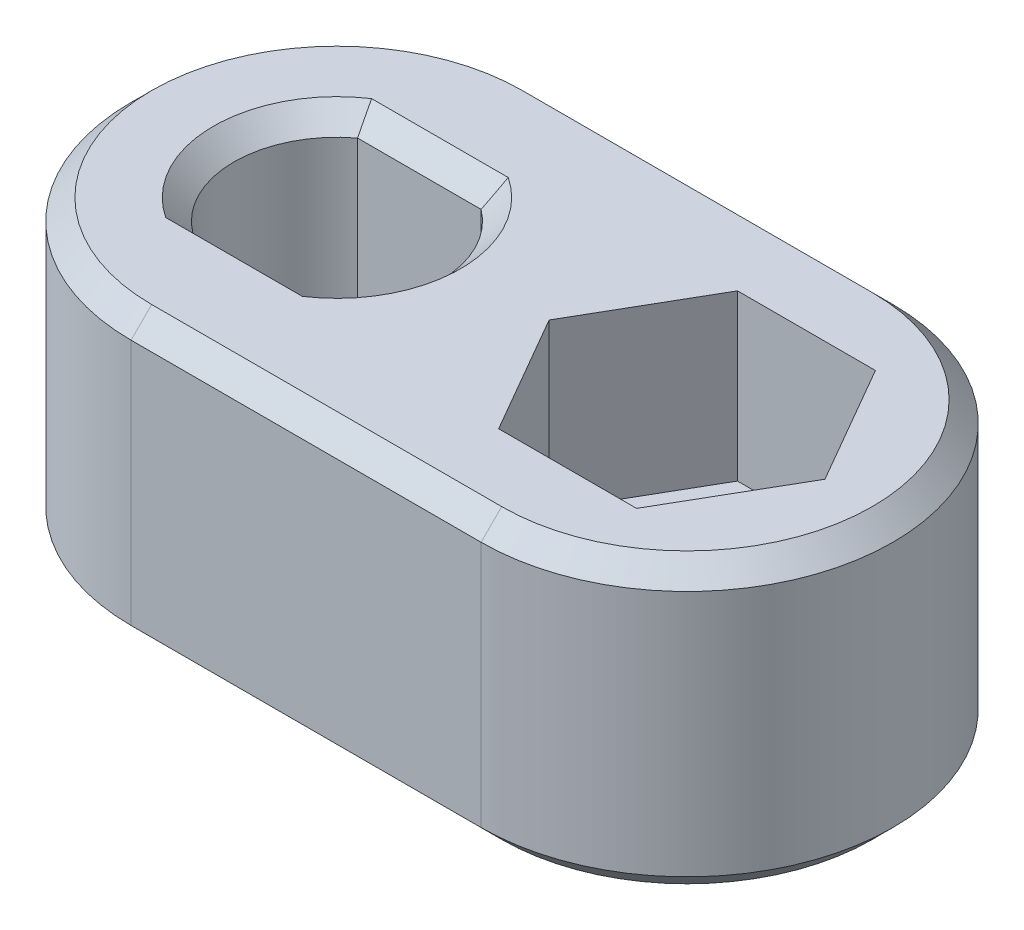
ISO-10303-21;
HEADER;
FILE_DESCRIPTION(('STEP AP214'),'2;1');
FILE_NAME('part.step','',(''),(''),'','','');
FILE_SCHEMA(('AUTOMOTIVE_DESIGN { 1 0 10303 214 1 1 1 1 }'));
ENDSEC;
DATA;
#1=APPLICATION_CONTEXT('core data for automotive mechanical design processes');
#2=APPLICATION_PROTOCOL_DEFINITION('international standard','automotive_design',2000,#1);
#3=PRODUCT_CONTEXT('',#1,'mechanical');
#4=PRODUCT('Part','Part','',(#3));
#5=PRODUCT_RELATED_PRODUCT_CATEGORY('part','',(#4));
#6=PRODUCT_DEFINITION_FORMATION('','',#4);
#7=PRODUCT_DEFINITION_CONTEXT('part definition',#1,'design');
#8=PRODUCT_DEFINITION('design','',#6,#7);
#9=PRODUCT_DEFINITION_SHAPE('','',#8);
#10=(LENGTH_UNIT() NAMED_UNIT(*) SI_UNIT(.MILLI.,.METRE.));
#11=(NAMED_UNIT(*) PLANE_ANGLE_UNIT() SI_UNIT($,.RADIAN.));
#12=(NAMED_UNIT(*) SI_UNIT($,.STERADIAN.) SOLID_ANGLE_UNIT());
#13=UNCERTAINTY_MEASURE_WITH_UNIT(LENGTH_MEASURE(1.E-05),#10,'distance_accuracy_value','');
#14=(GEOMETRIC_REPRESENTATION_CONTEXT(3) GLOBAL_UNCERTAINTY_ASSIGNED_CONTEXT((#13)) GLOBAL_UNIT_ASSIGNED_CONTEXT((#10,
#11,#12)) REPRESENTATION_CONTEXT('',''));
#15=CARTESIAN_POINT('',(0.,0.,0.));
#16=DIRECTION('',(0.,0.,1.));
#17=DIRECTION('',(1.,0.,0.));
#18=AXIS2_PLACEMENT_3D('',#15,#16,#17);
#19=CARTESIAN_POINT('',(8.5,0.,0.));
#20=DIRECTION('',(0.,-1.,0.));
#21=DIRECTION('',(0.,0.,-1.));
#22=AXIS2_PLACEMENT_3D('',#19,#20,#21);
#23=CYLINDRICAL_SURFACE('',#22,2.07500000000001);
#24=CARTESIAN_POINT('',(8.5,0.,0.));
#25=DIRECTION('',(0.,-1.,0.));
#26=DIRECTION('',(0.,0.,-1.));
#27=AXIS2_PLACEMENT_3D('',#24,#25,#26);
#28=CIRCLE('',#27,2.07500000000001);
#29=CARTESIAN_POINT('',(8.5,0.,-2.07500000000001));
#30=VERTEX_POINT('',#29);
#31=EDGE_CURVE('E238',#30,#30,#28,.T.);
#32=ORIENTED_EDGE('',*,*,#31,.T.);
#33=EDGE_LOOP('',(#32));
#34=FACE_BOUND('',#33,.T.);
#35=CARTESIAN_POINT('',(8.5,3.,0.));
#36=DIRECTION('',(0.,1.,0.));
#37=DIRECTION('',(0.,0.,1.));
#38=AXIS2_PLACEMENT_3D('',#35,#36,#37);
#39=CIRCLE('',#38,2.07500000000001);
#40=CARTESIAN_POINT('',(8.5,3.,2.07500000000001));
#41=VERTEX_POINT('',#40);
#42=EDGE_CURVE('E230',#41,#41,#39,.F.);
#43=ORIENTED_EDGE('',*,*,#42,.F.);
#44=EDGE_LOOP('',(#43));
#45=FACE_BOUND('',#44,.T.);
#46=ADVANCED_FACE('F37',(#34,#45),#23,.F.);
#47=CARTESIAN_POINT('',(0.,7.,0.));
#48=DIRECTION('',(0.,-1.,0.));
#49=DIRECTION('',(0.,0.,-1.));
#50=AXIS2_PLACEMENT_3D('',#47,#48,#49);
#51=CYLINDRICAL_SURFACE('',#50,5.);
#52=DIRECTION('',(0.,-1.,0.));
#53=VECTOR('',#52,1.);
#54=CARTESIAN_POINT('',(0.,7.,5.));
#55=LINE('',#54,#53);
#56=CARTESIAN_POINT('',(0.,6.49999999999999,5.));
#57=VERTEX_POINT('',#56);
#58=CARTESIAN_POINT('',(0.,0.500000000000004,5.));
#59=VERTEX_POINT('',#58);
#60=EDGE_CURVE('E279',#57,#59,#55,.T.);
#61=ORIENTED_EDGE('',*,*,#60,.F.);
#62=CARTESIAN_POINT('',(0.,6.49999999999999,0.));
#63=DIRECTION('',(0.,1.,0.));
#64=DIRECTION('',(0.,0.,1.));
#65=AXIS2_PLACEMENT_3D('',#62,#63,#64);
#66=CIRCLE('',#65,5.);
#67=CARTESIAN_POINT('',(0.,6.49999999999999,-5.));
#68=VERTEX_POINT('',#67);
#69=EDGE_CURVE('E325',#57,#68,#66,.F.);
#70=ORIENTED_EDGE('',*,*,#69,.T.);
#71=DIRECTION('',(0.,-1.,0.));
#72=VECTOR('',#71,1.);
#73=CARTESIAN_POINT('',(0.,7.,-5.));
#74=LINE('',#73,#72);
#75=CARTESIAN_POINT('',(0.,0.500000000000004,-5.));
#76=VERTEX_POINT('',#75);
#77=EDGE_CURVE('E262',#68,#76,#74,.T.);
#78=ORIENTED_EDGE('',*,*,#77,.T.);
#79=CARTESIAN_POINT('',(0.,0.500000000000004,0.));
#80=DIRECTION('',(0.,1.,0.));
#81=DIRECTION('',(0.,0.,1.));
#82=AXIS2_PLACEMENT_3D('',#79,#80,#81);
#83=CIRCLE('',#82,5.);
#84=EDGE_CURVE('E323',#76,#59,#83,.T.);
#85=ORIENTED_EDGE('',*,*,#84,.T.);
#86=EDGE_LOOP('',(#61,#70,#78,#85));
#87=FACE_BOUND('',#86,.T.);
#88=ADVANCED_FACE('F441',(#87),#51,.T.);
#89=CARTESIAN_POINT('',(0.,7.,5.));
#90=DIRECTION('',(0.,0.,-1.));
#91=DIRECTION('',(-1.,0.,0.));
#92=AXIS2_PLACEMENT_3D('',#89,#90,#91);
#93=PLANE('',#92);
#94=DIRECTION('',(0.,-1.,0.));
#95=VECTOR('',#94,1.);
#96=CARTESIAN_POINT('',(8.5,7.,5.));
#97=LINE('',#96,#95);
#98=CARTESIAN_POINT('',(8.5,6.49999999999999,5.));
#99=VERTEX_POINT('',#98);
#100=CARTESIAN_POINT('',(8.5,0.500000000000004,5.));
#101=VERTEX_POINT('',#100);
#102=EDGE_CURVE('E276',#99,#101,#97,.T.);
#103=ORIENTED_EDGE('',*,*,#102,.F.);
#104=DIRECTION('',(-1.,0.,0.));
#105=VECTOR('',#104,1.);
#106=CARTESIAN_POINT('',(0.,6.49999999999999,5.));
#107=LINE('',#106,#105);
#108=EDGE_CURVE('E316',#99,#57,#107,.T.);
#109=ORIENTED_EDGE('',*,*,#108,.T.);
#110=ORIENTED_EDGE('',*,*,#60,.T.);
#111=DIRECTION('',(1.,0.,0.));
#112=VECTOR('',#111,1.);
#113=CARTESIAN_POINT('',(0.,0.500000000000004,5.));
#114=LINE('',#113,#112);
#115=EDGE_CURVE('E313',#59,#101,#114,.T.);
#116=ORIENTED_EDGE('',*,*,#115,.T.);
#117=EDGE_LOOP('',(#103,#109,#110,#116));
#118=FACE_BOUND('',#117,.T.);
#119=ADVANCED_FACE('F448',(#118),#93,.F.);
#120=CARTESIAN_POINT('',(8.5,7.,0.));
#121=DIRECTION('',(0.,-1.,0.));
#122=DIRECTION('',(0.,0.,-1.));
#123=AXIS2_PLACEMENT_3D('',#120,#121,#122);
#124=CYLINDRICAL_SURFACE('',#123,5.);
#125=DIRECTION('',(0.,-1.,0.));
#126=VECTOR('',#125,1.);
#127=CARTESIAN_POINT('',(8.5,7.,-5.));
#128=LINE('',#127,#126);
#129=CARTESIAN_POINT('',(8.5,6.49999999999999,-5.));
#130=VERTEX_POINT('',#129);
#131=CARTESIAN_POINT('',(8.5,0.500000000000004,-5.));
#132=VERTEX_POINT('',#131);
#133=EDGE_CURVE('E273',#130,#132,#128,.T.);
#134=ORIENTED_EDGE('',*,*,#133,.F.);
#135=CARTESIAN_POINT('',(8.5,6.49999999999999,0.));
#136=DIRECTION('',(0.,1.,0.));
#137=DIRECTION('',(0.,0.,1.));
#138=AXIS2_PLACEMENT_3D('',#135,#136,#137);
#139=CIRCLE('',#138,5.);
#140=EDGE_CURVE('E321',#130,#99,#139,.F.);
#141=ORIENTED_EDGE('',*,*,#140,.T.);
#142=ORIENTED_EDGE('',*,*,#102,.T.);
#143=CARTESIAN_POINT('',(8.5,0.500000000000004,0.));
#144=DIRECTION('',(0.,1.,0.));
#145=DIRECTION('',(0.,0.,1.));
#146=AXIS2_PLACEMENT_3D('',#143,#144,#145);
#147=CIRCLE('',#146,5.);
#148=EDGE_CURVE('E319',#101,#132,#147,.T.);
#149=ORIENTED_EDGE('',*,*,#148,.T.);
#150=EDGE_LOOP('',(#134,#141,#142,#149));
#151=FACE_BOUND('',#150,.T.);
#152=ADVANCED_FACE('F489',(#151),#124,.T.);
#153=CARTESIAN_POINT('',(0.,7.,-5.));
#154=DIRECTION('',(0.,0.,1.));
#155=DIRECTION('',(1.,0.,0.));
#156=AXIS2_PLACEMENT_3D('',#153,#154,#155);
#157=PLANE('',#156);
#158=ORIENTED_EDGE('',*,*,#77,.F.);
#159=DIRECTION('',(1.,0.,0.));
#160=VECTOR('',#159,1.);
#161=CARTESIAN_POINT('',(8.5,6.49999999999999,-5.));
#162=LINE('',#161,#160);
#163=EDGE_CURVE('E329',#68,#130,#162,.T.);
#164=ORIENTED_EDGE('',*,*,#163,.T.);
#165=ORIENTED_EDGE('',*,*,#133,.T.);
#166=DIRECTION('',(-1.,0.,0.));
#167=VECTOR('',#166,1.);
#168=CARTESIAN_POINT('',(0.,0.500000000000004,-5.));
#169=LINE('',#168,#167);
#170=EDGE_CURVE('E327',#132,#76,#169,.T.);
#171=ORIENTED_EDGE('',*,*,#170,.T.);
#172=EDGE_LOOP('',(#158,#164,#165,#171));
#173=FACE_BOUND('',#172,.T.);
#174=ADVANCED_FACE('F483',(#173),#157,.F.);
#175=CARTESIAN_POINT('',(0.,7.,0.));
#176=DIRECTION('',(0.,1.,0.));
#177=DIRECTION('',(0.,0.,1.));
#178=AXIS2_PLACEMENT_3D('',#175,#176,#177);
#179=PLANE('',#178);
#180=CARTESIAN_POINT('',(0.,7.,0.));
#181=DIRECTION('',(0.,1.,0.));
#182=DIRECTION('',(0.,0.,1.));
#183=AXIS2_PLACEMENT_3D('',#180,#181,#182);
#184=CIRCLE('',#183,3.);
#185=CARTESIAN_POINT('',(1.6583123951777,7.,-2.5));
#186=VERTEX_POINT('',#185);
#187=CARTESIAN_POINT('',(1.6583123951777,7.,2.5));
#188=VERTEX_POINT('',#187);
#189=EDGE_CURVE('E302',#186,#188,#184,.F.);
#190=ORIENTED_EDGE('',*,*,#189,.T.);
#191=DIRECTION('',(-1.,0.,0.));
#192=VECTOR('',#191,1.);
#193=CARTESIAN_POINT('',(-1.5,7.,2.5));
#194=LINE('',#193,#192);
#195=CARTESIAN_POINT('',(-1.6583123951777,7.,2.5));
#196=VERTEX_POINT('',#195);
#197=EDGE_CURVE('E304',#188,#196,#194,.T.);
#198=ORIENTED_EDGE('',*,*,#197,.T.);
#199=CARTESIAN_POINT('',(0.,7.,0.));
#200=DIRECTION('',(0.,1.,0.));
#201=DIRECTION('',(0.,0.,1.));
#202=AXIS2_PLACEMENT_3D('',#199,#200,#201);
#203=CIRCLE('',#202,3.);
#204=CARTESIAN_POINT('',(-1.6583123951777,7.,-2.5));
#205=VERTEX_POINT('',#204);
#206=EDGE_CURVE('E300',#196,#205,#203,.F.);
#207=ORIENTED_EDGE('',*,*,#206,.T.);
#208=DIRECTION('',(1.,0.,0.));
#209=VECTOR('',#208,1.);
#210=CARTESIAN_POINT('',(1.5,7.,-2.5));
#211=LINE('',#210,#209);
#212=EDGE_CURVE('E298',#205,#186,#211,.T.);
#213=ORIENTED_EDGE('',*,*,#212,.T.);
#214=EDGE_LOOP('',(#190,#198,#207,#213));
#215=FACE_BOUND('',#214,.T.);
#216=CARTESIAN_POINT('',(0.,7.,0.));
#217=DIRECTION('',(0.,1.,0.));
#218=DIRECTION('',(0.,0.,1.));
#219=AXIS2_PLACEMENT_3D('',#216,#217,#218);
#220=CIRCLE('',#219,4.5);
#221=CARTESIAN_POINT('',(0.,7.,-4.5));
#222=VERTEX_POINT('',#221);
#223=CARTESIAN_POINT('',(0.,7.,4.5));
#224=VERTEX_POINT('',#223);
#225=EDGE_CURVE('E291',#222,#224,#220,.T.);
#226=ORIENTED_EDGE('',*,*,#225,.T.);
#227=DIRECTION('',(1.,0.,0.));
#228=VECTOR('',#227,1.);
#229=CARTESIAN_POINT('',(8.5,7.,4.5));
#230=LINE('',#229,#228);
#231=CARTESIAN_POINT('',(8.5,7.,4.5));
#232=VERTEX_POINT('',#231);
#233=EDGE_CURVE('E295',#224,#232,#230,.T.);
#234=ORIENTED_EDGE('',*,*,#233,.T.);
#235=CARTESIAN_POINT('',(8.5,7.,0.));
#236=DIRECTION('',(0.,1.,0.));
#237=DIRECTION('',(0.,0.,1.));
#238=AXIS2_PLACEMENT_3D('',#235,#236,#237);
#239=CIRCLE('',#238,4.5);
#240=CARTESIAN_POINT('',(8.5,7.,-4.5));
#241=VERTEX_POINT('',#240);
#242=EDGE_CURVE('E293',#232,#241,#239,.T.);
#243=ORIENTED_EDGE('',*,*,#242,.T.);
#244=DIRECTION('',(-1.,0.,0.));
#245=VECTOR('',#244,1.);
#246=CARTESIAN_POINT('',(0.,7.,-4.5));
#247=LINE('',#246,#245);
#248=EDGE_CURVE('E289',#241,#222,#247,.T.);
#249=ORIENTED_EDGE('',*,*,#248,.T.);
#250=EDGE_LOOP('',(#226,#234,#243,#249));
#251=FACE_BOUND('',#250,.T.);
#252=DIRECTION('',(-0.5,0.,-0.866025403784438));
#253=VECTOR('',#252,1.);
#254=CARTESIAN_POINT('',(11.8486315612999,7.,1.15412477997809E-12));
#255=LINE('',#254,#253);
#256=CARTESIAN_POINT('',(11.8486315612999,7.,1.15412477997809E-12));
#257=VERTEX_POINT('',#256);
#258=CARTESIAN_POINT('',(10.1743157806499,7.,-2.89999999999885));
#259=VERTEX_POINT('',#258);
#260=EDGE_CURVE('E184',#257,#259,#255,.T.);
#261=ORIENTED_EDGE('',*,*,#260,.F.);
#262=DIRECTION('',(0.500000000000001,0.,-0.866025403784438));
#263=VECTOR('',#262,1.);
#264=CARTESIAN_POINT('',(10.1743157806499,7.,2.90000000000116));
#265=LINE('',#264,#263);
#266=CARTESIAN_POINT('',(10.1743157806499,7.,2.90000000000116));
#267=VERTEX_POINT('',#266);
#268=EDGE_CURVE('E203',#267,#257,#265,.T.);
#269=ORIENTED_EDGE('',*,*,#268,.F.);
#270=DIRECTION('',(1.,0.,0.));
#271=VECTOR('',#270,1.);
#272=CARTESIAN_POINT('',(6.8256842193501,7.,2.90000000000116));
#273=LINE('',#272,#271);
#274=CARTESIAN_POINT('',(6.8256842193501,7.,2.90000000000116));
#275=VERTEX_POINT('',#274);
#276=EDGE_CURVE('E206',#275,#267,#273,.T.);
#277=ORIENTED_EDGE('',*,*,#276,.F.);
#278=DIRECTION('',(0.5,0.,0.866025403784439));
#279=VECTOR('',#278,1.);
#280=CARTESIAN_POINT('',(5.15136843870019,7.,1.15196115526774E-12));
#281=LINE('',#280,#279);
#282=CARTESIAN_POINT('',(5.15136843870019,7.,1.15196115526774E-12));
#283=VERTEX_POINT('',#282);
#284=EDGE_CURVE('E223',#283,#275,#281,.T.);
#285=ORIENTED_EDGE('',*,*,#284,.F.);
#286=DIRECTION('',(-0.5,0.,0.866025403784438));
#287=VECTOR('',#286,1.);
#288=CARTESIAN_POINT('',(6.82568421935011,7.,-2.89999999999885));
#289=LINE('',#288,#287);
#290=CARTESIAN_POINT('',(6.82568421935011,7.,-2.89999999999885));
#291=VERTEX_POINT('',#290);
#292=EDGE_CURVE('E220',#291,#283,#289,.T.);
#293=ORIENTED_EDGE('',*,*,#292,.F.);
#294=DIRECTION('',(-1.,0.,0.));
#295=VECTOR('',#294,1.);
#296=CARTESIAN_POINT('',(10.1743157806499,7.,-2.89999999999885));
#297=LINE('',#296,#295);
#298=EDGE_CURVE('E217',#259,#291,#297,.T.);
#299=ORIENTED_EDGE('',*,*,#298,.F.);
#300=EDGE_LOOP('',(#261,#269,#277,#285,#293,#299));
#301=FACE_BOUND('',#300,.T.);
#302=ADVANCED_FACE('F479',(#215,#251,#301),#179,.T.);
#303=CARTESIAN_POINT('',(0.,0.,0.));
#304=DIRECTION('',(0.,1.,0.));
#305=DIRECTION('',(0.,0.,1.));
#306=AXIS2_PLACEMENT_3D('',#303,#304,#305);
#307=PLANE('',#306);
#308=CARTESIAN_POINT('',(8.5,0.,0.));
#309=DIRECTION('',(0.,1.,0.));
#310=DIRECTION('',(0.,0.,1.));
#311=AXIS2_PLACEMENT_3D('',#308,#309,#310);
#312=CIRCLE('',#311,4.49999999999999);
#313=CARTESIAN_POINT('',(8.5,0.,-4.49999999999999));
#314=VERTEX_POINT('',#313);
#315=CARTESIAN_POINT('',(8.5,0.,4.49999999999999));
#316=VERTEX_POINT('',#315);
#317=EDGE_CURVE('E47',#314,#316,#312,.F.);
#318=ORIENTED_EDGE('',*,*,#317,.T.);
#319=DIRECTION('',(-1.,0.,0.));
#320=VECTOR('',#319,1.);
#321=CARTESIAN_POINT('',(0.,0.,4.49999999999999));
#322=LINE('',#321,#320);
#323=CARTESIAN_POINT('',(0.,0.,4.49999999999999));
#324=VERTEX_POINT('',#323);
#325=EDGE_CURVE('E11',#316,#324,#322,.T.);
#326=ORIENTED_EDGE('',*,*,#325,.T.);
#327=CARTESIAN_POINT('',(0.,0.,0.));
#328=DIRECTION('',(0.,1.,0.));
#329=DIRECTION('',(0.,0.,1.));
#330=AXIS2_PLACEMENT_3D('',#327,#328,#329);
#331=CIRCLE('',#330,4.49999999999999);
#332=CARTESIAN_POINT('',(0.,0.,-4.49999999999999));
#333=VERTEX_POINT('',#332);
#334=EDGE_CURVE('E333',#324,#333,#331,.F.);
#335=ORIENTED_EDGE('',*,*,#334,.T.);
#336=DIRECTION('',(1.,0.,0.));
#337=VECTOR('',#336,1.);
#338=CARTESIAN_POINT('',(0.,0.,-4.49999999999999));
#339=LINE('',#338,#337);
#340=EDGE_CURVE('E331',#333,#314,#339,.T.);
#341=ORIENTED_EDGE('',*,*,#340,.T.);
#342=EDGE_LOOP('',(#318,#326,#335,#341));
#343=FACE_BOUND('',#342,.T.);
#344=ORIENTED_EDGE('',*,*,#31,.F.);
#345=EDGE_LOOP('',(#344));
#346=FACE_BOUND('',#345,.T.);
#347=CARTESIAN_POINT('',(0.,0.,0.));
#348=DIRECTION('',(0.,-1.,0.));
#349=DIRECTION('',(0.,0.,-1.));
#350=AXIS2_PLACEMENT_3D('',#347,#348,#349);
#351=CIRCLE('',#350,3.36);
#352=CARTESIAN_POINT('',(0.,0.,-3.36));
#353=VERTEX_POINT('',#352);
#354=EDGE_CURVE('E241',#353,#353,#351,.T.);
#355=ORIENTED_EDGE('',*,*,#354,.F.);
#356=EDGE_LOOP('',(#355));
#357=FACE_BOUND('',#356,.T.);
#358=ADVANCED_FACE('F482',(#343,#346,#357),#307,.F.);
#359=CARTESIAN_POINT('',(0.,3.,0.));
#360=DIRECTION('',(0.,1.,0.));
#361=DIRECTION('',(0.,0.,1.));
#362=AXIS2_PLACEMENT_3D('',#359,#360,#361);
#363=CYLINDRICAL_SURFACE('',#362,2.5);
#364=DIRECTION('',(0.,1.,0.));
#365=VECTOR('',#364,1.);
#366=CARTESIAN_POINT('',(-1.5,3.,-2.));
#367=LINE('',#366,#365);
#368=CARTESIAN_POINT('',(-1.5,3.,-2.));
#369=VERTEX_POINT('',#368);
#370=CARTESIAN_POINT('',(-1.5,6.5,-2.));
#371=VERTEX_POINT('',#370);
#372=EDGE_CURVE('E259',#369,#371,#367,.T.);
#373=ORIENTED_EDGE('',*,*,#372,.T.);
#374=CARTESIAN_POINT('',(0.,6.5,0.));
#375=DIRECTION('',(0.,1.,0.));
#376=DIRECTION('',(0.,0.,1.));
#377=AXIS2_PLACEMENT_3D('',#374,#375,#376);
#378=CIRCLE('',#377,2.5);
#379=CARTESIAN_POINT('',(-1.5,6.5,2.));
#380=VERTEX_POINT('',#379);
#381=EDGE_CURVE('E309',#371,#380,#378,.T.);
#382=ORIENTED_EDGE('',*,*,#381,.T.);
#383=DIRECTION('',(0.,1.,0.));
#384=VECTOR('',#383,1.);
#385=CARTESIAN_POINT('',(-1.5,3.,2.));
#386=LINE('',#385,#384);
#387=CARTESIAN_POINT('',(-1.5,3.,2.));
#388=VERTEX_POINT('',#387);
#389=EDGE_CURVE('E258',#388,#380,#386,.T.);
#390=ORIENTED_EDGE('',*,*,#389,.F.);
#391=CARTESIAN_POINT('',(0.,3.,0.));
#392=DIRECTION('',(0.,1.,0.));
#393=DIRECTION('',(0.,0.,1.));
#394=AXIS2_PLACEMENT_3D('',#391,#392,#393);
#395=CIRCLE('',#394,2.5);
#396=EDGE_CURVE('E248',#369,#388,#395,.T.);
#397=ORIENTED_EDGE('',*,*,#396,.F.);
#398=EDGE_LOOP('',(#373,#382,#390,#397));
#399=FACE_BOUND('',#398,.T.);
#400=ADVANCED_FACE('F471',(#399),#363,.F.);
#401=CARTESIAN_POINT('',(0.,3.,-2.));
#402=DIRECTION('',(0.,0.,-1.));
#403=DIRECTION('',(-1.,0.,0.));
#404=AXIS2_PLACEMENT_3D('',#401,#402,#403);
#405=PLANE('',#404);
#406=DIRECTION('',(0.,1.,0.));
#407=VECTOR('',#406,1.);
#408=CARTESIAN_POINT('',(1.5,3.,-2.));
#409=LINE('',#408,#407);
#410=CARTESIAN_POINT('',(1.5,3.,-2.));
#411=VERTEX_POINT('',#410);
#412=CARTESIAN_POINT('',(1.5,6.5,-2.));
#413=VERTEX_POINT('',#412);
#414=EDGE_CURVE('E263',#411,#413,#409,.T.);
#415=ORIENTED_EDGE('',*,*,#414,.T.);
#416=DIRECTION('',(-1.,0.,0.));
#417=VECTOR('',#416,1.);
#418=CARTESIAN_POINT('',(-1.5,6.5,-2.));
#419=LINE('',#418,#417);
#420=EDGE_CURVE('E311',#413,#371,#419,.T.);
#421=ORIENTED_EDGE('',*,*,#420,.T.);
#422=ORIENTED_EDGE('',*,*,#372,.F.);
#423=DIRECTION('',(-1.,0.,0.));
#424=VECTOR('',#423,1.);
#425=CARTESIAN_POINT('',(0.,3.,-2.));
#426=LINE('',#425,#424);
#427=EDGE_CURVE('E255',#411,#369,#426,.T.);
#428=ORIENTED_EDGE('',*,*,#427,.F.);
#429=EDGE_LOOP('',(#415,#421,#422,#428));
#430=FACE_BOUND('',#429,.T.);
#431=ADVANCED_FACE('F467',(#430),#405,.F.);
#432=DIRECTION('',(0.,1.,0.));
#433=VECTOR('',#432,1.);
#434=CARTESIAN_POINT('',(1.5,3.,2.));
#435=LINE('',#434,#433);
#436=CARTESIAN_POINT('',(1.5,3.,2.));
#437=VERTEX_POINT('',#436);
#438=CARTESIAN_POINT('',(1.5,6.5,2.));
#439=VERTEX_POINT('',#438);
#440=EDGE_CURVE('E266',#437,#439,#435,.T.);
#441=ORIENTED_EDGE('',*,*,#440,.T.);
#442=CARTESIAN_POINT('',(0.,6.5,0.));
#443=DIRECTION('',(0.,1.,0.));
#444=DIRECTION('',(0.,0.,1.));
#445=AXIS2_PLACEMENT_3D('',#442,#443,#444);
#446=CIRCLE('',#445,2.5);
#447=EDGE_CURVE('E307',#439,#413,#446,.T.);
#448=ORIENTED_EDGE('',*,*,#447,.T.);
#449=ORIENTED_EDGE('',*,*,#414,.F.);
#450=EDGE_CURVE('E252',#437,#411,#395,.T.);
#451=ORIENTED_EDGE('',*,*,#450,.F.);
#452=EDGE_LOOP('',(#441,#448,#449,#451));
#453=FACE_BOUND('',#452,.T.);
#454=ADVANCED_FACE('F470',(#453),#363,.F.);
#455=CARTESIAN_POINT('',(0.,3.,2.));
#456=DIRECTION('',(0.,0.,1.));
#457=DIRECTION('',(1.,0.,0.));
#458=AXIS2_PLACEMENT_3D('',#455,#456,#457);
#459=PLANE('',#458);
#460=ORIENTED_EDGE('',*,*,#389,.T.);
#461=DIRECTION('',(1.,0.,0.));
#462=VECTOR('',#461,1.);
#463=CARTESIAN_POINT('',(1.5,6.5,2.));
#464=LINE('',#463,#462);
#465=EDGE_CURVE('E282',#380,#439,#464,.T.);
#466=ORIENTED_EDGE('',*,*,#465,.T.);
#467=ORIENTED_EDGE('',*,*,#440,.F.);
#468=DIRECTION('',(1.,0.,0.));
#469=VECTOR('',#468,1.);
#470=CARTESIAN_POINT('',(0.,3.,2.));
#471=LINE('',#470,#469);
#472=EDGE_CURVE('E251',#388,#437,#471,.T.);
#473=ORIENTED_EDGE('',*,*,#472,.F.);
#474=EDGE_LOOP('',(#460,#466,#467,#473));
#475=FACE_BOUND('',#474,.T.);
#476=ADVANCED_FACE('F465',(#475),#459,.F.);
#477=CARTESIAN_POINT('',(0.,3.,0.));
#478=DIRECTION('',(0.,1.,0.));
#479=DIRECTION('',(0.,0.,1.));
#480=AXIS2_PLACEMENT_3D('',#477,#478,#479);
#481=PLANE('',#480);
#482=CARTESIAN_POINT('',(0.,3.,0.));
#483=DIRECTION('',(0.,1.,0.));
#484=DIRECTION('',(0.,0.,1.));
#485=AXIS2_PLACEMENT_3D('',#482,#483,#484);
#486=CIRCLE('',#485,1.7);
#487=CARTESIAN_POINT('',(0.,3.,1.7));
#488=VERTEX_POINT('',#487);
#489=EDGE_CURVE('E247',#488,#488,#486,.T.);
#490=ORIENTED_EDGE('',*,*,#489,.F.);
#491=EDGE_LOOP('',(#490));
#492=FACE_BOUND('',#491,.T.);
#493=ORIENTED_EDGE('',*,*,#396,.T.);
#494=ORIENTED_EDGE('',*,*,#472,.T.);
#495=ORIENTED_EDGE('',*,*,#450,.T.);
#496=ORIENTED_EDGE('',*,*,#427,.T.);
#497=EDGE_LOOP('',(#493,#494,#495,#496));
#498=FACE_BOUND('',#497,.T.);
#499=ADVANCED_FACE('F461',(#492,#498),#481,.T.);
#500=CARTESIAN_POINT('',(0.,0.,0.));
#501=DIRECTION('',(0.,-1.,0.));
#502=DIRECTION('',(0.,0.,-1.));
#503=AXIS2_PLACEMENT_3D('',#500,#501,#502);
#504=CYLINDRICAL_SURFACE('',#503,1.7);
#505=ORIENTED_EDGE('',*,*,#489,.T.);
#506=EDGE_LOOP('',(#505));
#507=FACE_BOUND('',#506,.T.);
#508=CARTESIAN_POINT('',(0.,1.66,0.));
#509=DIRECTION('',(0.,-1.,0.));
#510=DIRECTION('',(0.,0.,-1.));
#511=AXIS2_PLACEMENT_3D('',#508,#509,#510);
#512=CIRCLE('',#511,1.7);
#513=CARTESIAN_POINT('',(0.,1.66,-1.7));
#514=VERTEX_POINT('',#513);
#515=EDGE_CURVE('E244',#514,#514,#512,.T.);
#516=ORIENTED_EDGE('',*,*,#515,.T.);
#517=EDGE_LOOP('',(#516));
#518=FACE_BOUND('',#517,.T.);
#519=ADVANCED_FACE('F457',(#507,#518),#504,.F.);
#520=CARTESIAN_POINT('',(0.,0.,0.));
#521=DIRECTION('',(0.,-1.,0.));
#522=DIRECTION('',(0.,0.,-1.));
#523=AXIS2_PLACEMENT_3D('',#520,#521,#522);
#524=CONICAL_SURFACE('',#523,3.36,0.785398163397448);
#525=ORIENTED_EDGE('',*,*,#515,.F.);
#526=EDGE_LOOP('',(#525));
#527=FACE_BOUND('',#526,.T.);
#528=ORIENTED_EDGE('',*,*,#354,.T.);
#529=EDGE_LOOP('',(#528));
#530=FACE_BOUND('',#529,.T.);
#531=ADVANCED_FACE('F454',(#527,#530),#524,.F.);
#532=CARTESIAN_POINT('',(0.,3.,0.));
#533=DIRECTION('',(0.,1.,0.));
#534=DIRECTION('',(0.,0.,1.));
#535=AXIS2_PLACEMENT_3D('',#532,#533,#534);
#536=PLANE('',#535);
#537=DIRECTION('',(-0.5,0.,-0.866025403784438));
#538=VECTOR('',#537,1.);
#539=CARTESIAN_POINT('',(11.8486315612999,3.,1.15412477997809E-12));
#540=LINE('',#539,#538);
#541=CARTESIAN_POINT('',(11.8486315612999,3.,1.15412477997809E-12));
#542=VERTEX_POINT('',#541);
#543=CARTESIAN_POINT('',(10.1743157806499,3.,-2.89999999999885));
#544=VERTEX_POINT('',#543);
#545=EDGE_CURVE('E181',#542,#544,#540,.T.);
#546=ORIENTED_EDGE('',*,*,#545,.T.);
#547=DIRECTION('',(-1.,0.,0.));
#548=VECTOR('',#547,1.);
#549=CARTESIAN_POINT('',(10.1743157806499,3.,-2.89999999999885));
#550=LINE('',#549,#548);
#551=CARTESIAN_POINT('',(6.82568421935011,3.,-2.89999999999885));
#552=VERTEX_POINT('',#551);
#553=EDGE_CURVE('E192',#544,#552,#550,.T.);
#554=ORIENTED_EDGE('',*,*,#553,.T.);
#555=DIRECTION('',(-0.5,0.,0.866025403784438));
#556=VECTOR('',#555,1.);
#557=CARTESIAN_POINT('',(6.82568421935011,3.,-2.89999999999885));
#558=LINE('',#557,#556);
#559=CARTESIAN_POINT('',(5.15136843870019,3.,1.15196115526774E-12));
#560=VERTEX_POINT('',#559);
#561=EDGE_CURVE('E197',#552,#560,#558,.T.);
#562=ORIENTED_EDGE('',*,*,#561,.T.);
#563=DIRECTION('',(0.5,0.,0.866025403784439));
#564=VECTOR('',#563,1.);
#565=CARTESIAN_POINT('',(5.15136843870019,3.,1.15196115526774E-12));
#566=LINE('',#565,#564);
#567=CARTESIAN_POINT('',(6.8256842193501,3.,2.90000000000116));
#568=VERTEX_POINT('',#567);
#569=EDGE_CURVE('E210',#560,#568,#566,.T.);
#570=ORIENTED_EDGE('',*,*,#569,.T.);
#571=DIRECTION('',(1.,0.,0.));
#572=VECTOR('',#571,1.);
#573=CARTESIAN_POINT('',(6.8256842193501,3.,2.90000000000116));
#574=LINE('',#573,#572);
#575=CARTESIAN_POINT('',(10.1743157806499,3.,2.90000000000116));
#576=VERTEX_POINT('',#575);
#577=EDGE_CURVE('E213',#568,#576,#574,.T.);
#578=ORIENTED_EDGE('',*,*,#577,.T.);
#579=DIRECTION('',(0.500000000000001,0.,-0.866025403784438));
#580=VECTOR('',#579,1.);
#581=CARTESIAN_POINT('',(10.1743157806499,3.,2.90000000000116));
#582=LINE('',#581,#580);
#583=EDGE_CURVE('E189',#576,#542,#582,.T.);
#584=ORIENTED_EDGE('',*,*,#583,.T.);
#585=EDGE_LOOP('',(#546,#554,#562,#570,#578,#584));
#586=FACE_BOUND('',#585,.T.);
#587=ORIENTED_EDGE('',*,*,#42,.T.);
#588=EDGE_LOOP('',(#587));
#589=FACE_BOUND('',#588,.T.);
#590=ADVANCED_FACE('F199',(#586,#589),#536,.T.);
#591=CARTESIAN_POINT('',(11.8486315612999,3.,1.15412477997809E-12));
#592=DIRECTION('',(0.866025403784438,0.,-0.5));
#593=DIRECTION('',(-0.5,0.,-0.866025403784438));
#594=AXIS2_PLACEMENT_3D('',#591,#592,#593);
#595=PLANE('',#594);
#596=ORIENTED_EDGE('',*,*,#260,.T.);
#597=DIRECTION('',(0.,1.,0.));
#598=VECTOR('',#597,1.);
#599=CARTESIAN_POINT('',(10.1743157806499,3.,-2.89999999999885));
#600=LINE('',#599,#598);
#601=EDGE_CURVE('E177',#544,#259,#600,.T.);
#602=ORIENTED_EDGE('',*,*,#601,.F.);
#603=ORIENTED_EDGE('',*,*,#545,.F.);
#604=DIRECTION('',(0.,1.,0.));
#605=VECTOR('',#604,1.);
#606=CARTESIAN_POINT('',(11.8486315612999,3.,1.15412477997809E-12));
#607=LINE('',#606,#605);
#608=EDGE_CURVE('E228',#542,#257,#607,.T.);
#609=ORIENTED_EDGE('',*,*,#608,.T.);
#610=EDGE_LOOP('',(#596,#602,#603,#609));
#611=FACE_BOUND('',#610,.T.);
#612=ADVANCED_FACE('F179',(#611),#595,.F.);
#613=CARTESIAN_POINT('',(10.1743157806499,3.,2.90000000000116));
#614=DIRECTION('',(0.866025403784438,0.,0.500000000000001));
#615=DIRECTION('',(0.500000000000001,0.,-0.866025403784438));
#616=AXIS2_PLACEMENT_3D('',#613,#614,#615);
#617=PLANE('',#616);
#618=ORIENTED_EDGE('',*,*,#268,.T.);
#619=ORIENTED_EDGE('',*,*,#608,.F.);
#620=ORIENTED_EDGE('',*,*,#583,.F.);
#621=DIRECTION('',(0.,1.,0.));
#622=VECTOR('',#621,1.);
#623=CARTESIAN_POINT('',(10.1743157806499,3.,2.90000000000116));
#624=LINE('',#623,#622);
#625=EDGE_CURVE('E231',#576,#267,#624,.T.);
#626=ORIENTED_EDGE('',*,*,#625,.T.);
#627=EDGE_LOOP('',(#618,#619,#620,#626));
#628=FACE_BOUND('',#627,.T.);
#629=ADVANCED_FACE('F549',(#628),#617,.F.);
#630=CARTESIAN_POINT('',(6.8256842193501,3.,2.90000000000116));
#631=DIRECTION('',(0.,0.,1.));
#632=DIRECTION('',(1.,0.,0.));
#633=AXIS2_PLACEMENT_3D('',#630,#631,#632);
#634=PLANE('',#633);
#635=ORIENTED_EDGE('',*,*,#276,.T.);
#636=ORIENTED_EDGE('',*,*,#625,.F.);
#637=ORIENTED_EDGE('',*,*,#577,.F.);
#638=DIRECTION('',(0.,1.,0.));
#639=VECTOR('',#638,1.);
#640=CARTESIAN_POINT('',(6.8256842193501,3.,2.90000000000116));
#641=LINE('',#640,#639);
#642=EDGE_CURVE('E233',#568,#275,#641,.T.);
#643=ORIENTED_EDGE('',*,*,#642,.T.);
#644=EDGE_LOOP('',(#635,#636,#637,#643));
#645=FACE_BOUND('',#644,.T.);
#646=ADVANCED_FACE('F547',(#645),#634,.F.);
#647=CARTESIAN_POINT('',(5.15136843870019,3.,1.15196115526774E-12));
#648=DIRECTION('',(-0.866025403784439,0.,0.5));
#649=DIRECTION('',(0.5,0.,0.866025403784439));
#650=AXIS2_PLACEMENT_3D('',#647,#648,#649);
#651=PLANE('',#650);
#652=ORIENTED_EDGE('',*,*,#284,.T.);
#653=ORIENTED_EDGE('',*,*,#642,.F.);
#654=ORIENTED_EDGE('',*,*,#569,.F.);
#655=DIRECTION('',(0.,1.,0.));
#656=VECTOR('',#655,1.);
#657=CARTESIAN_POINT('',(5.15136843870019,3.,1.15196115526774E-12));
#658=LINE('',#657,#656);
#659=EDGE_CURVE('E235',#560,#283,#658,.T.);
#660=ORIENTED_EDGE('',*,*,#659,.T.);
#661=EDGE_LOOP('',(#652,#653,#654,#660));
#662=FACE_BOUND('',#661,.T.);
#663=ADVANCED_FACE('F545',(#662),#651,.F.);
#664=CARTESIAN_POINT('',(6.82568421935011,3.,-2.89999999999885));
#665=DIRECTION('',(-0.866025403784439,0.,-0.5));
#666=DIRECTION('',(-0.5,0.,0.866025403784438));
#667=AXIS2_PLACEMENT_3D('',#664,#665,#666);
#668=PLANE('',#667);
#669=ORIENTED_EDGE('',*,*,#292,.T.);
#670=ORIENTED_EDGE('',*,*,#659,.F.);
#671=ORIENTED_EDGE('',*,*,#561,.F.);
#672=DIRECTION('',(0.,1.,0.));
#673=VECTOR('',#672,1.);
#674=CARTESIAN_POINT('',(6.82568421935011,3.,-2.89999999999885));
#675=LINE('',#674,#673);
#676=EDGE_CURVE('E188',#552,#291,#675,.T.);
#677=ORIENTED_EDGE('',*,*,#676,.T.);
#678=EDGE_LOOP('',(#669,#670,#671,#677));
#679=FACE_BOUND('',#678,.T.);
#680=ADVANCED_FACE('F541',(#679),#668,.F.);
#681=CARTESIAN_POINT('',(10.1743157806499,3.,-2.89999999999885));
#682=DIRECTION('',(0.,0.,-1.));
#683=DIRECTION('',(-1.,0.,0.));
#684=AXIS2_PLACEMENT_3D('',#681,#682,#683);
#685=PLANE('',#684);
#686=ORIENTED_EDGE('',*,*,#298,.T.);
#687=ORIENTED_EDGE('',*,*,#676,.F.);
#688=ORIENTED_EDGE('',*,*,#553,.F.);
#689=ORIENTED_EDGE('',*,*,#601,.T.);
#690=EDGE_LOOP('',(#686,#687,#688,#689));
#691=FACE_BOUND('',#690,.T.);
#692=ADVANCED_FACE('F193',(#691),#685,.F.);
#693=CARTESIAN_POINT('',(0.,6.5,-2.));
#694=DIRECTION('',(0.,0.707106781186547,0.707106781186547));
#695=DIRECTION('',(1.,0.,0.));
#696=AXIS2_PLACEMENT_3D('',#693,#694,#695);
#697=PLANE('',#696);
#698=CARTESIAN_POINT('',(1.5,6.5,-2.));
#699=CARTESIAN_POINT('',(1.52764420802877,6.58313427543744,-2.08313427543744));
#700=CARTESIAN_POINT('',(1.55465904424928,6.66636818822682,-2.16636818822682));
#701=CARTESIAN_POINT('',(1.60742983610777,6.83303485592792,-2.33303485592792));
#702=CARTESIAN_POINT('',(1.63318579827982,6.9164676098052,-2.4164676098052));
#703=CARTESIAN_POINT('',(1.6583123951777,7.,-2.5));
#704=B_SPLINE_CURVE_WITH_KNOTS('',3,(#698,#699,#700,#701,#702,#703),.UNSPECIFIED.,.F.,.F.,(4,2,
4),(0.,0.362312197796798,0.724622514843557),.UNSPECIFIED.);
#705=EDGE_CURVE('E368',#186,#413,#704,.F.);
#706=ORIENTED_EDGE('',*,*,#705,.F.);
#707=ORIENTED_EDGE('',*,*,#212,.F.);
#708=CARTESIAN_POINT('',(-1.6583123951777,7.,-2.5));
#709=CARTESIAN_POINT('',(-1.63318579827982,6.9164676098052,-2.4164676098052));
#710=CARTESIAN_POINT('',(-1.60742983610777,6.83303485592792,-2.33303485592792));
#711=CARTESIAN_POINT('',(-1.55465904424928,6.66636818822683,-2.16636818822683));
#712=CARTESIAN_POINT('',(-1.52764420802877,6.58313427543744,-2.08313427543744));
#713=CARTESIAN_POINT('',(-1.5,6.5,-2.));
#714=B_SPLINE_CURVE_WITH_KNOTS('',3,(#708,#709,#710,#711,#712,#713),.UNSPECIFIED.,.F.,.F.,(4,2,
4),(0.,0.362310317046758,0.724622514843557),.UNSPECIFIED.);
#715=EDGE_CURVE('E218',#371,#205,#714,.F.);
#716=ORIENTED_EDGE('',*,*,#715,.F.);
#717=ORIENTED_EDGE('',*,*,#420,.F.);
#718=EDGE_LOOP('',(#706,#707,#716,#717));
#719=FACE_BOUND('',#718,.T.);
#720=ADVANCED_FACE('F381',(#719),#697,.T.);
#721=CARTESIAN_POINT('',(0.,6.5,0.));
#722=DIRECTION('',(0.,1.,0.));
#723=DIRECTION('',(0.,0.,1.));
#724=AXIS2_PLACEMENT_3D('',#721,#722,#723);
#725=CONICAL_SURFACE('',#724,2.5,0.785398163397448);
#726=ORIENTED_EDGE('',*,*,#715,.T.);
#727=ORIENTED_EDGE('',*,*,#206,.F.);
#728=CARTESIAN_POINT('',(-1.6583123951777,7.,2.5));
#729=CARTESIAN_POINT('',(-1.63318579827982,6.9164676098052,2.4164676098052));
#730=CARTESIAN_POINT('',(-1.60742983610777,6.83303485592792,2.33303485592792));
#731=CARTESIAN_POINT('',(-1.55465904424928,6.66636818822683,2.16636818822683));
#732=CARTESIAN_POINT('',(-1.52764420802877,6.58313427543744,2.08313427543744));
#733=CARTESIAN_POINT('',(-1.5,6.5,2.));
#734=B_SPLINE_CURVE_WITH_KNOTS('',3,(#728,#729,#730,#731,#732,#733),.UNSPECIFIED.,.F.,.F.,(4,2,
4),(0.,0.362310317046758,0.724622514843557),.UNSPECIFIED.);
#735=EDGE_CURVE('E344',#380,#196,#734,.F.);
#736=ORIENTED_EDGE('',*,*,#735,.F.);
#737=ORIENTED_EDGE('',*,*,#381,.F.);
#738=EDGE_LOOP('',(#726,#727,#736,#737));
#739=FACE_BOUND('',#738,.T.);
#740=ADVANCED_FACE('F363',(#739),#725,.F.);
#741=CARTESIAN_POINT('',(0.,6.5,0.));
#742=DIRECTION('',(0.,1.,0.));
#743=DIRECTION('',(0.,0.,1.));
#744=AXIS2_PLACEMENT_3D('',#741,#742,#743);
#745=CONICAL_SURFACE('',#744,2.5,0.785398163397448);
#746=ORIENTED_EDGE('',*,*,#705,.T.);
#747=ORIENTED_EDGE('',*,*,#447,.F.);
#748=CARTESIAN_POINT('',(1.5,6.5,2.));
#749=CARTESIAN_POINT('',(1.52764420802877,6.58313427543744,2.08313427543744));
#750=CARTESIAN_POINT('',(1.55465904424928,6.66636818822682,2.16636818822682));
#751=CARTESIAN_POINT('',(1.60742983610777,6.83303485592792,2.33303485592792));
#752=CARTESIAN_POINT('',(1.63318579827982,6.9164676098052,2.4164676098052));
#753=CARTESIAN_POINT('',(1.6583123951777,7.,2.5));
#754=B_SPLINE_CURVE_WITH_KNOTS('',3,(#748,#749,#750,#751,#752,#753),.UNSPECIFIED.,.F.,.F.,(4,2,
4),(0.,0.362312197796798,0.724622514843557),.UNSPECIFIED.);
#755=EDGE_CURVE('E336',#188,#439,#754,.F.);
#756=ORIENTED_EDGE('',*,*,#755,.F.);
#757=ORIENTED_EDGE('',*,*,#189,.F.);
#758=EDGE_LOOP('',(#746,#747,#756,#757));
#759=FACE_BOUND('',#758,.T.);
#760=ADVANCED_FACE('F357',(#759),#745,.F.);
#761=CARTESIAN_POINT('',(0.,6.5,2.));
#762=DIRECTION('',(0.,0.707106781186547,-0.707106781186547));
#763=DIRECTION('',(-1.,0.,0.));
#764=AXIS2_PLACEMENT_3D('',#761,#762,#763);
#765=PLANE('',#764);
#766=ORIENTED_EDGE('',*,*,#735,.T.);
#767=ORIENTED_EDGE('',*,*,#197,.F.);
#768=ORIENTED_EDGE('',*,*,#755,.T.);
#769=ORIENTED_EDGE('',*,*,#465,.F.);
#770=EDGE_LOOP('',(#766,#767,#768,#769));
#771=FACE_BOUND('',#770,.T.);
#772=ADVANCED_FACE('F353',(#771),#765,.T.);
#773=CARTESIAN_POINT('',(0.,7.,-4.5));
#774=DIRECTION('',(0.,0.707106781186545,-0.70710678118655));
#775=DIRECTION('',(1.,0.,0.));
#776=AXIS2_PLACEMENT_3D('',#773,#774,#775);
#777=PLANE('',#776);
#778=DIRECTION('',(0.,0.70710678118655,0.707106781186545));
#779=VECTOR('',#778,1.);
#780=CARTESIAN_POINT('',(8.5,6.49999999999999,-5.));
#781=LINE('',#780,#779);
#782=EDGE_CURVE('E510',#130,#241,#781,.T.);
#783=ORIENTED_EDGE('',*,*,#782,.F.);
#784=ORIENTED_EDGE('',*,*,#163,.F.);
#785=DIRECTION('',(0.,-0.70710678118655,-0.707106781186545));
#786=VECTOR('',#785,1.);
#787=CARTESIAN_POINT('',(0.,7.,-4.5));
#788=LINE('',#787,#786);
#789=EDGE_CURVE('E345',#222,#68,#788,.T.);
#790=ORIENTED_EDGE('',*,*,#789,.F.);
#791=ORIENTED_EDGE('',*,*,#248,.F.);
#792=EDGE_LOOP('',(#783,#784,#790,#791));
#793=FACE_BOUND('',#792,.T.);
#794=ADVANCED_FACE('F410',(#793),#777,.T.);
#795=CARTESIAN_POINT('',(0.,7.,0.));
#796=DIRECTION('',(0.,-1.,0.));
#797=DIRECTION('',(0.,0.,-1.));
#798=AXIS2_PLACEMENT_3D('',#795,#796,#797);
#799=CONICAL_SURFACE('',#798,4.5,0.785398163397445);
#800=ORIENTED_EDGE('',*,*,#789,.T.);
#801=ORIENTED_EDGE('',*,*,#69,.F.);
#802=DIRECTION('',(0.,-0.70710678118655,0.707106781186545));
#803=VECTOR('',#802,1.);
#804=CARTESIAN_POINT('',(0.,7.,4.5));
#805=LINE('',#804,#803);
#806=EDGE_CURVE('E506',#224,#57,#805,.T.);
#807=ORIENTED_EDGE('',*,*,#806,.F.);
#808=ORIENTED_EDGE('',*,*,#225,.F.);
#809=EDGE_LOOP('',(#800,#801,#807,#808));
#810=FACE_BOUND('',#809,.T.);
#811=ADVANCED_FACE('F403',(#810),#799,.T.);
#812=CARTESIAN_POINT('',(8.5,7.,0.));
#813=DIRECTION('',(0.,-1.,0.));
#814=DIRECTION('',(0.,0.,-1.));
#815=AXIS2_PLACEMENT_3D('',#812,#813,#814);
#816=CONICAL_SURFACE('',#815,4.5,0.785398163397445);
#817=ORIENTED_EDGE('',*,*,#782,.T.);
#818=ORIENTED_EDGE('',*,*,#242,.F.);
#819=DIRECTION('',(0.,0.70710678118655,-0.707106781186545));
#820=VECTOR('',#819,1.);
#821=CARTESIAN_POINT('',(8.5,6.49999999999999,5.));
#822=LINE('',#821,#820);
#823=EDGE_CURVE('E503',#99,#232,#822,.T.);
#824=ORIENTED_EDGE('',*,*,#823,.F.);
#825=ORIENTED_EDGE('',*,*,#140,.F.);
#826=EDGE_LOOP('',(#817,#818,#824,#825));
#827=FACE_BOUND('',#826,.T.);
#828=ADVANCED_FACE('F396',(#827),#816,.T.);
#829=CARTESIAN_POINT('',(0.,7.,4.5));
#830=DIRECTION('',(0.,0.707106781186545,0.70710678118655));
#831=DIRECTION('',(-1.,0.,0.));
#832=AXIS2_PLACEMENT_3D('',#829,#830,#831);
#833=PLANE('',#832);
#834=ORIENTED_EDGE('',*,*,#806,.T.);
#835=ORIENTED_EDGE('',*,*,#108,.F.);
#836=ORIENTED_EDGE('',*,*,#823,.T.);
#837=ORIENTED_EDGE('',*,*,#233,.F.);
#838=EDGE_LOOP('',(#834,#835,#836,#837));
#839=FACE_BOUND('',#838,.T.);
#840=ADVANCED_FACE('F389',(#839),#833,.T.);
#841=CARTESIAN_POINT('',(0.,0.500000000000004,-5.));
#842=DIRECTION('',(0.,0.70710678118655,0.707106781186545));
#843=DIRECTION('',(-1.,0.,0.));
#844=AXIS2_PLACEMENT_3D('',#841,#842,#843);
#845=PLANE('',#844);
#846=DIRECTION('',(0.,0.707106781186545,-0.70710678118655));
#847=VECTOR('',#846,1.);
#848=CARTESIAN_POINT('',(8.5,0.,-4.49999999999999));
#849=LINE('',#848,#847);
#850=EDGE_CURVE('E512',#314,#132,#849,.T.);
#851=ORIENTED_EDGE('',*,*,#850,.F.);
#852=ORIENTED_EDGE('',*,*,#340,.F.);
#853=DIRECTION('',(0.,-0.707106781186545,0.70710678118655));
#854=VECTOR('',#853,1.);
#855=CARTESIAN_POINT('',(0.,0.500000000000004,-5.));
#856=LINE('',#855,#854);
#857=EDGE_CURVE('E42',#76,#333,#856,.T.);
#858=ORIENTED_EDGE('',*,*,#857,.F.);
#859=ORIENTED_EDGE('',*,*,#170,.F.);
#860=EDGE_LOOP('',(#851,#852,#858,#859));
#861=FACE_BOUND('',#860,.T.);
#862=ADVANCED_FACE('F40',(#861),#845,.F.);
#863=CARTESIAN_POINT('',(0.,0.500000000000004,0.));
#864=DIRECTION('',(0.,1.,0.));
#865=DIRECTION('',(0.,0.,1.));
#866=AXIS2_PLACEMENT_3D('',#863,#864,#865);
#867=CONICAL_SURFACE('',#866,5.,0.785398163397452);
#868=ORIENTED_EDGE('',*,*,#857,.T.);
#869=ORIENTED_EDGE('',*,*,#334,.F.);
#870=DIRECTION('',(0.,-0.707106781186545,-0.70710678118655));
#871=VECTOR('',#870,1.);
#872=CARTESIAN_POINT('',(0.,0.500000000000004,5.));
#873=LINE('',#872,#871);
#874=EDGE_CURVE('E60',#59,#324,#873,.T.);
#875=ORIENTED_EDGE('',*,*,#874,.F.);
#876=ORIENTED_EDGE('',*,*,#84,.F.);
#877=EDGE_LOOP('',(#868,#869,#875,#876));
#878=FACE_BOUND('',#877,.T.);
#879=ADVANCED_FACE('F429',(#878),#867,.T.);
#880=CARTESIAN_POINT('',(8.5,0.500000000000004,0.));
#881=DIRECTION('',(0.,1.,0.));
#882=DIRECTION('',(0.,0.,1.));
#883=AXIS2_PLACEMENT_3D('',#880,#881,#882);
#884=CONICAL_SURFACE('',#883,5.,0.785398163397452);
#885=ORIENTED_EDGE('',*,*,#850,.T.);
#886=ORIENTED_EDGE('',*,*,#148,.F.);
#887=DIRECTION('',(0.,0.707106781186545,0.70710678118655));
#888=VECTOR('',#887,1.);
#889=CARTESIAN_POINT('',(8.5,0.,4.49999999999999));
#890=LINE('',#889,#888);
#891=EDGE_CURVE('E517',#316,#101,#890,.T.);
#892=ORIENTED_EDGE('',*,*,#891,.F.);
#893=ORIENTED_EDGE('',*,*,#317,.F.);
#894=EDGE_LOOP('',(#885,#886,#892,#893));
#895=FACE_BOUND('',#894,.T.);
#896=ADVANCED_FACE('F424',(#895),#884,.T.);
#897=CARTESIAN_POINT('',(0.,0.500000000000004,5.));
#898=DIRECTION('',(0.,0.70710678118655,-0.707106781186545));
#899=DIRECTION('',(1.,0.,0.));
#900=AXIS2_PLACEMENT_3D('',#897,#898,#899);
#901=PLANE('',#900);
#902=ORIENTED_EDGE('',*,*,#874,.T.);
#903=ORIENTED_EDGE('',*,*,#325,.F.);
#904=ORIENTED_EDGE('',*,*,#891,.T.);
#905=ORIENTED_EDGE('',*,*,#115,.F.);
#906=EDGE_LOOP('',(#902,#903,#904,#905));
#907=FACE_BOUND('',#906,.T.);
#908=ADVANCED_FACE('F418',(#907),#901,.F.);
#909=CLOSED_SHELL('',(#46,#88,#119,#152,#174,#302,#358,#400,#431,#454,#476,#499,#519,#531,#590,
#612,#629,#646,#663,#680,#692,#720,#740,#760,#772,#794,#811,#828,#840,#862,#879,#896,#908));
#910=MANIFOLD_SOLID_BREP('B2',#909);
#911=ADVANCED_BREP_SHAPE_REPRESENTATION('',(#18,#910),#14);
#912=SHAPE_DEFINITION_REPRESENTATION(#9,#911);
ENDSEC;
END-ISO-10303-21;
